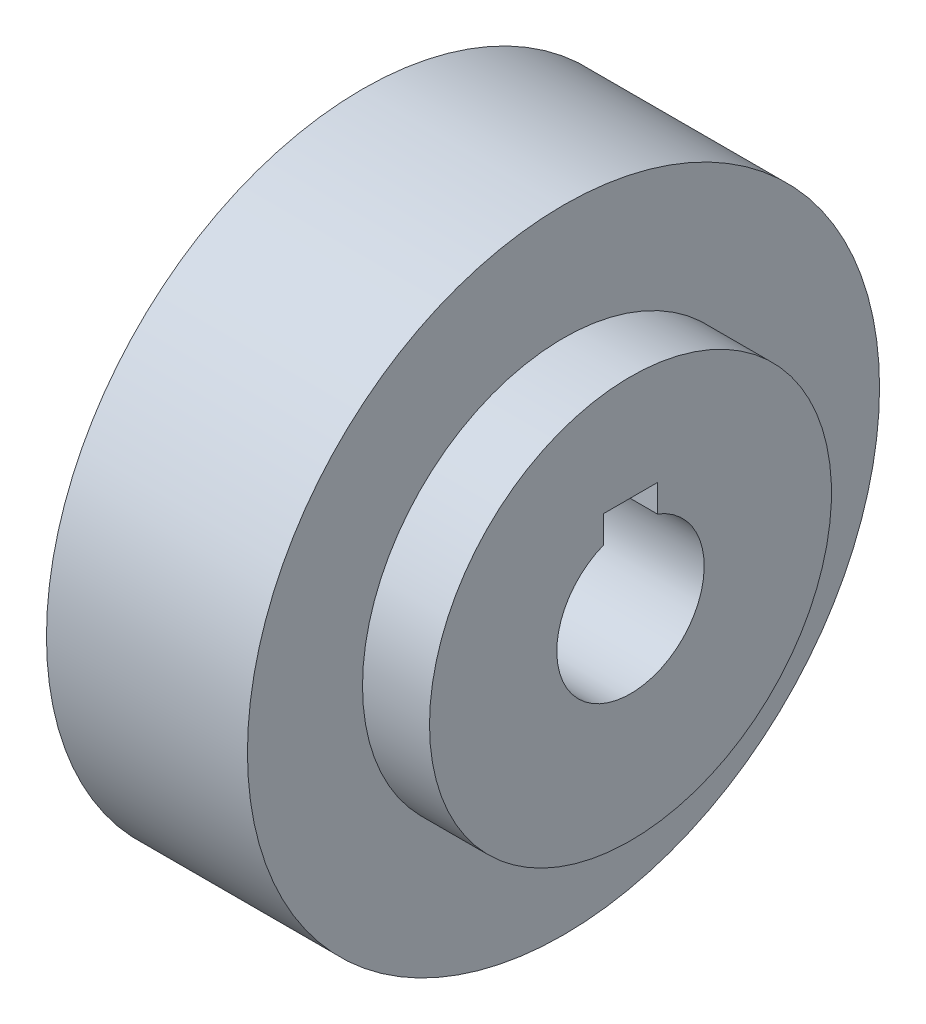
ISO-10303-21;
HEADER;
FILE_DESCRIPTION(('STEP AP214'),'2;1');
FILE_NAME('part.step','',(''),(''),'','','');
FILE_SCHEMA(('AUTOMOTIVE_DESIGN { 1 0 10303 214 1 1 1 1 }'));
ENDSEC;
DATA;
#1=APPLICATION_CONTEXT('core data for automotive mechanical design processes');
#2=APPLICATION_PROTOCOL_DEFINITION('international standard','automotive_design',2000,#1);
#3=PRODUCT_CONTEXT('',#1,'mechanical');
#4=PRODUCT('Part','Part','',(#3));
#5=PRODUCT_RELATED_PRODUCT_CATEGORY('part','',(#4));
#6=PRODUCT_DEFINITION_FORMATION('','',#4);
#7=PRODUCT_DEFINITION_CONTEXT('part definition',#1,'design');
#8=PRODUCT_DEFINITION('design','',#6,#7);
#9=PRODUCT_DEFINITION_SHAPE('','',#8);
#10=(LENGTH_UNIT() NAMED_UNIT(*) SI_UNIT(.MILLI.,.METRE.));
#11=(NAMED_UNIT(*) PLANE_ANGLE_UNIT() SI_UNIT($,.RADIAN.));
#12=(NAMED_UNIT(*) SI_UNIT($,.STERADIAN.) SOLID_ANGLE_UNIT());
#13=UNCERTAINTY_MEASURE_WITH_UNIT(LENGTH_MEASURE(1.E-05),#10,'distance_accuracy_value','');
#14=(GEOMETRIC_REPRESENTATION_CONTEXT(3) GLOBAL_UNCERTAINTY_ASSIGNED_CONTEXT((#13)) GLOBAL_UNIT_ASSIGNED_CONTEXT((#10,
#11,#12)) REPRESENTATION_CONTEXT('',''));
#15=CARTESIAN_POINT('',(0.,0.,0.));
#16=DIRECTION('',(0.,0.,1.));
#17=DIRECTION('',(1.,0.,0.));
#18=AXIS2_PLACEMENT_3D('',#15,#16,#17);
#19=CARTESIAN_POINT('',(0.,0.,0.));
#20=DIRECTION('',(-1.,0.,0.));
#21=DIRECTION('',(0.,0.,1.));
#22=AXIS2_PLACEMENT_3D('',#19,#20,#21);
#23=CYLINDRICAL_SURFACE('',#22,11.);
#24=CARTESIAN_POINT('',(0.,0.,0.));
#25=DIRECTION('',(-1.,0.,0.));
#26=DIRECTION('',(0.,0.,1.));
#27=AXIS2_PLACEMENT_3D('',#24,#25,#26);
#28=CIRCLE('',#27,11.);
#29=CARTESIAN_POINT('',(0.,10.2469507659596,-4.));
#30=VERTEX_POINT('',#29);
#31=CARTESIAN_POINT('',(0.,10.2469507659596,4.));
#32=VERTEX_POINT('',#31);
#33=EDGE_CURVE('E40',#30,#32,#28,.T.);
#34=ORIENTED_EDGE('',*,*,#33,.T.);
#35=DIRECTION('',(-1.,0.,0.));
#36=VECTOR('',#35,1.);
#37=CARTESIAN_POINT('',(0.,10.2469507659596,4.));
#38=LINE('',#37,#36);
#39=CARTESIAN_POINT('',(40.,10.2469507659596,4.));
#40=VERTEX_POINT('',#39);
#41=EDGE_CURVE('E93',#32,#40,#38,.F.);
#42=ORIENTED_EDGE('',*,*,#41,.T.);
#43=CARTESIAN_POINT('',(40.,0.,0.));
#44=DIRECTION('',(-1.,0.,0.));
#45=DIRECTION('',(0.,0.,1.));
#46=AXIS2_PLACEMENT_3D('',#43,#44,#45);
#47=CIRCLE('',#46,11.);
#48=CARTESIAN_POINT('',(40.,10.2469507659596,-4.));
#49=VERTEX_POINT('',#48);
#50=EDGE_CURVE('E89',#49,#40,#47,.T.);
#51=ORIENTED_EDGE('',*,*,#50,.F.);
#52=DIRECTION('',(-1.,0.,0.));
#53=VECTOR('',#52,1.);
#54=CARTESIAN_POINT('',(0.,10.2469507659596,-4.));
#55=LINE('',#54,#53);
#56=EDGE_CURVE('E98',#49,#30,#55,.T.);
#57=ORIENTED_EDGE('',*,*,#56,.T.);
#58=EDGE_LOOP('',(#34,#42,#51,#57));
#59=FACE_BOUND('',#58,.T.);
#60=ADVANCED_FACE('F33',(#59),#23,.F.);
#61=CARTESIAN_POINT('',(0.,11.,0.));
#62=DIRECTION('',(1.,0.,0.));
#63=DIRECTION('',(0.,0.,-1.));
#64=AXIS2_PLACEMENT_3D('',#61,#62,#63);
#65=PLANE('',#64);
#66=DIRECTION('',(0.,0.,-1.));
#67=VECTOR('',#66,1.);
#68=CARTESIAN_POINT('',(0.,14.3,-4.));
#69=LINE('',#68,#67);
#70=CARTESIAN_POINT('',(0.,14.3,4.));
#71=VERTEX_POINT('',#70);
#72=CARTESIAN_POINT('',(0.,14.3,-4.));
#73=VERTEX_POINT('',#72);
#74=EDGE_CURVE('E115',#71,#73,#69,.T.);
#75=ORIENTED_EDGE('',*,*,#74,.F.);
#76=DIRECTION('',(0.,1.,0.));
#77=VECTOR('',#76,1.);
#78=CARTESIAN_POINT('',(0.,7.69999999999999,4.));
#79=LINE('',#78,#77);
#80=EDGE_CURVE('E73',#32,#71,#79,.T.);
#81=ORIENTED_EDGE('',*,*,#80,.F.);
#82=ORIENTED_EDGE('',*,*,#33,.F.);
#83=DIRECTION('',(0.,-1.,0.));
#84=VECTOR('',#83,1.);
#85=CARTESIAN_POINT('',(0.,7.69999999999999,-4.));
#86=LINE('',#85,#84);
#87=EDGE_CURVE('E83',#73,#30,#86,.T.);
#88=ORIENTED_EDGE('',*,*,#87,.F.);
#89=EDGE_LOOP('',(#75,#81,#82,#88));
#90=FACE_BOUND('',#89,.T.);
#91=CARTESIAN_POINT('',(0.,0.,0.));
#92=DIRECTION('',(-1.,0.,0.));
#93=DIRECTION('',(0.,0.,1.));
#94=AXIS2_PLACEMENT_3D('',#91,#92,#93);
#95=CIRCLE('',#94,47.175);
#96=CARTESIAN_POINT('',(0.,0.,47.175));
#97=VERTEX_POINT('',#96);
#98=EDGE_CURVE('E107',#97,#97,#95,.T.);
#99=ORIENTED_EDGE('',*,*,#98,.T.);
#100=EDGE_LOOP('',(#99));
#101=FACE_BOUND('',#100,.T.);
#102=ADVANCED_FACE('F113',(#90,#101),#65,.F.);
#103=CARTESIAN_POINT('',(0.,0.,0.));
#104=DIRECTION('',(-1.,0.,0.));
#105=DIRECTION('',(0.,0.,1.));
#106=AXIS2_PLACEMENT_3D('',#103,#104,#105);
#107=CYLINDRICAL_SURFACE('',#106,47.175);
#108=ORIENTED_EDGE('',*,*,#98,.F.);
#109=EDGE_LOOP('',(#108));
#110=FACE_BOUND('',#109,.T.);
#111=CARTESIAN_POINT('',(30.,0.,0.));
#112=DIRECTION('',(-1.,0.,0.));
#113=DIRECTION('',(0.,0.,1.));
#114=AXIS2_PLACEMENT_3D('',#111,#112,#113);
#115=CIRCLE('',#114,47.175);
#116=CARTESIAN_POINT('',(30.,0.,47.175));
#117=VERTEX_POINT('',#116);
#118=EDGE_CURVE('E104',#117,#117,#115,.T.);
#119=ORIENTED_EDGE('',*,*,#118,.T.);
#120=EDGE_LOOP('',(#119));
#121=FACE_BOUND('',#120,.T.);
#122=ADVANCED_FACE('F134',(#110,#121),#107,.T.);
#123=CARTESIAN_POINT('',(30.,47.175,0.));
#124=DIRECTION('',(-1.,0.,0.));
#125=DIRECTION('',(0.,0.,1.));
#126=AXIS2_PLACEMENT_3D('',#123,#124,#125);
#127=PLANE('',#126);
#128=ORIENTED_EDGE('',*,*,#118,.F.);
#129=EDGE_LOOP('',(#128));
#130=FACE_BOUND('',#129,.T.);
#131=CARTESIAN_POINT('',(30.,0.,0.));
#132=DIRECTION('',(-1.,0.,0.));
#133=DIRECTION('',(0.,0.,1.));
#134=AXIS2_PLACEMENT_3D('',#131,#132,#133);
#135=CIRCLE('',#134,30.);
#136=CARTESIAN_POINT('',(30.,0.,30.));
#137=VERTEX_POINT('',#136);
#138=EDGE_CURVE('E96',#137,#137,#135,.T.);
#139=ORIENTED_EDGE('',*,*,#138,.T.);
#140=EDGE_LOOP('',(#139));
#141=FACE_BOUND('',#140,.T.);
#142=ADVANCED_FACE('F138',(#130,#141),#127,.F.);
#143=CARTESIAN_POINT('',(0.,0.,0.));
#144=DIRECTION('',(-1.,0.,0.));
#145=DIRECTION('',(0.,0.,1.));
#146=AXIS2_PLACEMENT_3D('',#143,#144,#145);
#147=CYLINDRICAL_SURFACE('',#146,30.);
#148=ORIENTED_EDGE('',*,*,#138,.F.);
#149=EDGE_LOOP('',(#148));
#150=FACE_BOUND('',#149,.T.);
#151=CARTESIAN_POINT('',(40.,0.,0.));
#152=DIRECTION('',(-1.,0.,0.));
#153=DIRECTION('',(0.,0.,1.));
#154=AXIS2_PLACEMENT_3D('',#151,#152,#153);
#155=CIRCLE('',#154,30.);
#156=CARTESIAN_POINT('',(40.,0.,30.));
#157=VERTEX_POINT('',#156);
#158=EDGE_CURVE('E92',#157,#157,#155,.T.);
#159=ORIENTED_EDGE('',*,*,#158,.T.);
#160=EDGE_LOOP('',(#159));
#161=FACE_BOUND('',#160,.T.);
#162=ADVANCED_FACE('F144',(#150,#161),#147,.T.);
#163=CARTESIAN_POINT('',(40.,30.,0.));
#164=DIRECTION('',(-1.,0.,0.));
#165=DIRECTION('',(0.,0.,1.));
#166=AXIS2_PLACEMENT_3D('',#163,#164,#165);
#167=PLANE('',#166);
#168=ORIENTED_EDGE('',*,*,#50,.T.);
#169=DIRECTION('',(0.,1.,0.));
#170=VECTOR('',#169,1.);
#171=CARTESIAN_POINT('',(40.,30.,4.));
#172=LINE('',#171,#170);
#173=CARTESIAN_POINT('',(40.,14.3,4.));
#174=VERTEX_POINT('',#173);
#175=EDGE_CURVE('E11',#40,#174,#172,.T.);
#176=ORIENTED_EDGE('',*,*,#175,.T.);
#177=DIRECTION('',(0.,0.,-1.));
#178=VECTOR('',#177,1.);
#179=CARTESIAN_POINT('',(40.,14.3,-4.));
#180=LINE('',#179,#178);
#181=CARTESIAN_POINT('',(40.,14.3,-4.));
#182=VERTEX_POINT('',#181);
#183=EDGE_CURVE('E80',#174,#182,#180,.T.);
#184=ORIENTED_EDGE('',*,*,#183,.T.);
#185=DIRECTION('',(0.,-1.,0.));
#186=VECTOR('',#185,1.);
#187=CARTESIAN_POINT('',(40.,7.69999999999999,-4.));
#188=LINE('',#187,#186);
#189=EDGE_CURVE('E47',#182,#49,#188,.T.);
#190=ORIENTED_EDGE('',*,*,#189,.T.);
#191=EDGE_LOOP('',(#168,#176,#184,#190));
#192=FACE_BOUND('',#191,.T.);
#193=ORIENTED_EDGE('',*,*,#158,.F.);
#194=EDGE_LOOP('',(#193));
#195=FACE_BOUND('',#194,.T.);
#196=ADVANCED_FACE('F86',(#192,#195),#167,.F.);
#197=CARTESIAN_POINT('',(40.,7.69999999999999,4.));
#198=DIRECTION('',(0.,0.,1.));
#199=DIRECTION('',(1.,0.,0.));
#200=AXIS2_PLACEMENT_3D('',#197,#198,#199);
#201=PLANE('',#200);
#202=ORIENTED_EDGE('',*,*,#80,.T.);
#203=DIRECTION('',(-1.,0.,0.));
#204=VECTOR('',#203,1.);
#205=CARTESIAN_POINT('',(40.,14.3,4.));
#206=LINE('',#205,#204);
#207=EDGE_CURVE('E69',#174,#71,#206,.T.);
#208=ORIENTED_EDGE('',*,*,#207,.F.);
#209=ORIENTED_EDGE('',*,*,#175,.F.);
#210=ORIENTED_EDGE('',*,*,#41,.F.);
#211=EDGE_LOOP('',(#202,#208,#209,#210));
#212=FACE_BOUND('',#211,.T.);
#213=ADVANCED_FACE('F71',(#212),#201,.F.);
#214=CARTESIAN_POINT('',(40.,7.69999999999999,-4.));
#215=DIRECTION('',(0.,0.,-1.));
#216=DIRECTION('',(-1.,0.,0.));
#217=AXIS2_PLACEMENT_3D('',#214,#215,#216);
#218=PLANE('',#217);
#219=ORIENTED_EDGE('',*,*,#189,.F.);
#220=DIRECTION('',(-1.,0.,0.));
#221=VECTOR('',#220,1.);
#222=CARTESIAN_POINT('',(40.,14.3,-4.));
#223=LINE('',#222,#221);
#224=EDGE_CURVE('E77',#182,#73,#223,.T.);
#225=ORIENTED_EDGE('',*,*,#224,.T.);
#226=ORIENTED_EDGE('',*,*,#87,.T.);
#227=ORIENTED_EDGE('',*,*,#56,.F.);
#228=EDGE_LOOP('',(#219,#225,#226,#227));
#229=FACE_BOUND('',#228,.T.);
#230=ADVANCED_FACE('F121',(#229),#218,.F.);
#231=CARTESIAN_POINT('',(40.,14.3,-4.));
#232=DIRECTION('',(0.,1.,0.));
#233=DIRECTION('',(0.,0.,1.));
#234=AXIS2_PLACEMENT_3D('',#231,#232,#233);
#235=PLANE('',#234);
#236=ORIENTED_EDGE('',*,*,#74,.T.);
#237=ORIENTED_EDGE('',*,*,#224,.F.);
#238=ORIENTED_EDGE('',*,*,#183,.F.);
#239=ORIENTED_EDGE('',*,*,#207,.T.);
#240=EDGE_LOOP('',(#236,#237,#238,#239));
#241=FACE_BOUND('',#240,.T.);
#242=ADVANCED_FACE('F81',(#241),#235,.F.);
#243=CLOSED_SHELL('',(#60,#102,#122,#142,#162,#196,#213,#230,#242));
#244=MANIFOLD_SOLID_BREP('B2',#243);
#245=ADVANCED_BREP_SHAPE_REPRESENTATION('',(#18,#244),#14);
#246=SHAPE_DEFINITION_REPRESENTATION(#9,#245);
ENDSEC;
END-ISO-10303-21;
